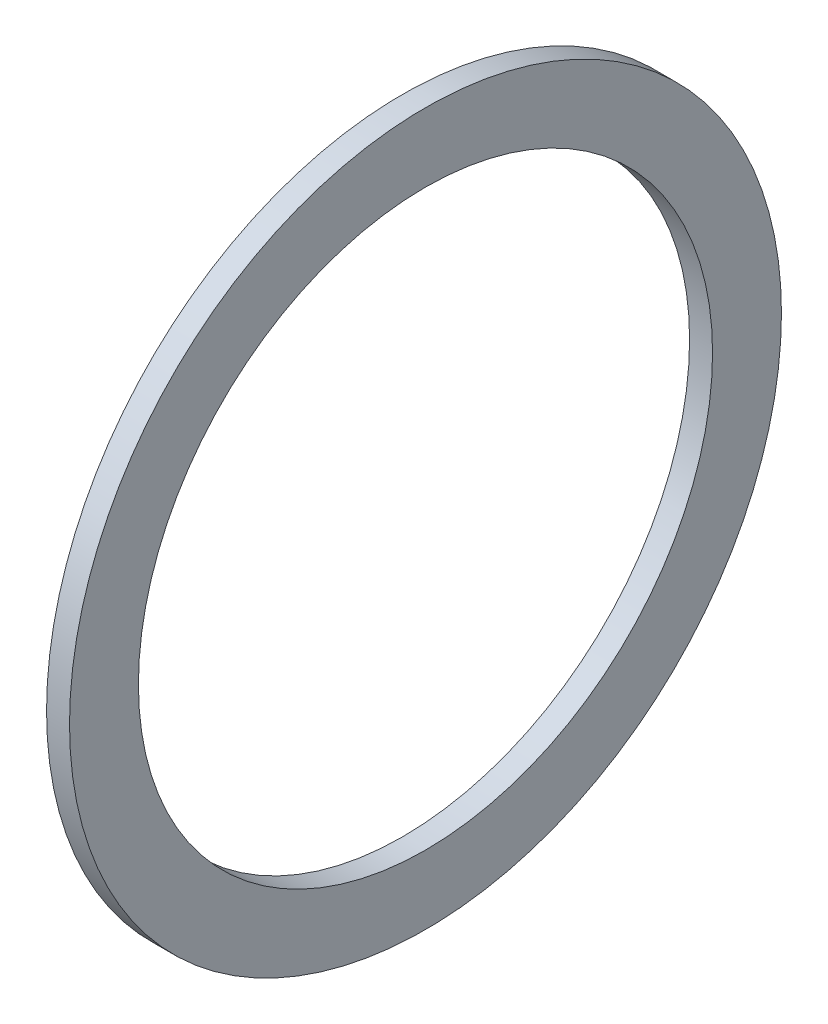
ISO-10303-21;
HEADER;
FILE_DESCRIPTION(('STEP AP214'),'2;1');
FILE_NAME('part.step','',(''),(''),'','','');
FILE_SCHEMA(('AUTOMOTIVE_DESIGN { 1 0 10303 214 1 1 1 1 }'));
ENDSEC;
DATA;
#1=APPLICATION_CONTEXT('core data for automotive mechanical design processes');
#2=APPLICATION_PROTOCOL_DEFINITION('international standard','automotive_design',2000,#1);
#3=PRODUCT_CONTEXT('',#1,'mechanical');
#4=PRODUCT('Part','Part','',(#3));
#5=PRODUCT_RELATED_PRODUCT_CATEGORY('part','',(#4));
#6=PRODUCT_DEFINITION_FORMATION('','',#4);
#7=PRODUCT_DEFINITION_CONTEXT('part definition',#1,'design');
#8=PRODUCT_DEFINITION('design','',#6,#7);
#9=PRODUCT_DEFINITION_SHAPE('','',#8);
#10=(LENGTH_UNIT() NAMED_UNIT(*) SI_UNIT(.MILLI.,.METRE.));
#11=(NAMED_UNIT(*) PLANE_ANGLE_UNIT() SI_UNIT($,.RADIAN.));
#12=(NAMED_UNIT(*) SI_UNIT($,.STERADIAN.) SOLID_ANGLE_UNIT());
#13=UNCERTAINTY_MEASURE_WITH_UNIT(LENGTH_MEASURE(1.E-05),#10,'distance_accuracy_value','');
#14=(GEOMETRIC_REPRESENTATION_CONTEXT(3) GLOBAL_UNCERTAINTY_ASSIGNED_CONTEXT((#13)) GLOBAL_UNIT_ASSIGNED_CONTEXT((#10,
#11,#12)) REPRESENTATION_CONTEXT('',''));
#15=CARTESIAN_POINT('',(0.,0.,0.));
#16=DIRECTION('',(0.,0.,1.));
#17=DIRECTION('',(1.,0.,0.));
#18=AXIS2_PLACEMENT_3D('',#15,#16,#17);
#19=CARTESIAN_POINT('',(1.5875,0.,0.));
#20=DIRECTION('',(1.,0.,0.));
#21=DIRECTION('',(0.,0.,-1.));
#22=AXIS2_PLACEMENT_3D('',#19,#20,#21);
#23=PLANE('',#22);
#24=CARTESIAN_POINT('',(1.5875,0.,0.));
#25=DIRECTION('',(1.,0.,0.));
#26=DIRECTION('',(0.,0.,-1.));
#27=AXIS2_PLACEMENT_3D('',#24,#25,#26);
#28=CIRCLE('',#27,49.2125);
#29=CARTESIAN_POINT('',(1.5875,0.,-49.2125));
#30=VERTEX_POINT('',#29);
#31=EDGE_CURVE('E10',#30,#30,#28,.T.);
#32=ORIENTED_EDGE('',*,*,#31,.T.);
#33=EDGE_LOOP('',(#32));
#34=FACE_BOUND('',#33,.T.);
#35=CARTESIAN_POINT('',(1.5875,0.,0.));
#36=DIRECTION('',(1.,0.,0.));
#37=DIRECTION('',(0.,0.,-1.));
#38=AXIS2_PLACEMENT_3D('',#35,#36,#37);
#39=CIRCLE('',#38,39.6875);
#40=CARTESIAN_POINT('',(1.5875,0.,-39.6875));
#41=VERTEX_POINT('',#40);
#42=EDGE_CURVE('E42',#41,#41,#39,.T.);
#43=ORIENTED_EDGE('',*,*,#42,.F.);
#44=EDGE_LOOP('',(#43));
#45=FACE_BOUND('',#44,.T.);
#46=ADVANCED_FACE('F31',(#34,#45),#23,.T.);
#47=CARTESIAN_POINT('',(-1.5875,0.,0.));
#48=DIRECTION('',(1.,0.,0.));
#49=DIRECTION('',(0.,0.,-1.));
#50=AXIS2_PLACEMENT_3D('',#47,#48,#49);
#51=PLANE('',#50);
#52=CARTESIAN_POINT('',(-1.5875,0.,0.));
#53=DIRECTION('',(1.,0.,0.));
#54=DIRECTION('',(0.,0.,-1.));
#55=AXIS2_PLACEMENT_3D('',#52,#53,#54);
#56=CIRCLE('',#55,49.2125);
#57=CARTESIAN_POINT('',(-1.5875,0.,-49.2125));
#58=VERTEX_POINT('',#57);
#59=EDGE_CURVE('E35',#58,#58,#56,.T.);
#60=ORIENTED_EDGE('',*,*,#59,.F.);
#61=EDGE_LOOP('',(#60));
#62=FACE_BOUND('',#61,.T.);
#63=CARTESIAN_POINT('',(-1.5875,0.,0.));
#64=DIRECTION('',(1.,0.,0.));
#65=DIRECTION('',(0.,0.,-1.));
#66=AXIS2_PLACEMENT_3D('',#63,#64,#65);
#67=CIRCLE('',#66,39.6875);
#68=CARTESIAN_POINT('',(-1.5875,0.,-39.6875));
#69=VERTEX_POINT('',#68);
#70=EDGE_CURVE('E44',#69,#69,#67,.T.);
#71=ORIENTED_EDGE('',*,*,#70,.T.);
#72=EDGE_LOOP('',(#71));
#73=FACE_BOUND('',#72,.T.);
#74=ADVANCED_FACE('F54',(#62,#73),#51,.F.);
#75=CARTESIAN_POINT('',(1.5875,0.,0.));
#76=DIRECTION('',(-1.,0.,0.));
#77=DIRECTION('',(0.,0.,1.));
#78=AXIS2_PLACEMENT_3D('',#75,#76,#77);
#79=CYLINDRICAL_SURFACE('',#78,49.2125);
#80=ORIENTED_EDGE('',*,*,#31,.F.);
#81=EDGE_LOOP('',(#80));
#82=FACE_BOUND('',#81,.T.);
#83=ORIENTED_EDGE('',*,*,#59,.T.);
#84=EDGE_LOOP('',(#83));
#85=FACE_BOUND('',#84,.T.);
#86=ADVANCED_FACE('F33',(#82,#85),#79,.T.);
#87=CARTESIAN_POINT('',(1.5875,0.,0.));
#88=DIRECTION('',(-1.,0.,0.));
#89=DIRECTION('',(0.,0.,1.));
#90=AXIS2_PLACEMENT_3D('',#87,#88,#89);
#91=CYLINDRICAL_SURFACE('',#90,39.6875);
#92=ORIENTED_EDGE('',*,*,#42,.T.);
#93=EDGE_LOOP('',(#92));
#94=FACE_BOUND('',#93,.T.);
#95=ORIENTED_EDGE('',*,*,#70,.F.);
#96=EDGE_LOOP('',(#95));
#97=FACE_BOUND('',#96,.T.);
#98=ADVANCED_FACE('F50',(#94,#97),#91,.F.);
#99=CLOSED_SHELL('',(#46,#74,#86,#98));
#100=MANIFOLD_SOLID_BREP('B2',#99);
#101=ADVANCED_BREP_SHAPE_REPRESENTATION('',(#18,#100),#14);
#102=SHAPE_DEFINITION_REPRESENTATION(#9,#101);
ENDSEC;
END-ISO-10303-21;
